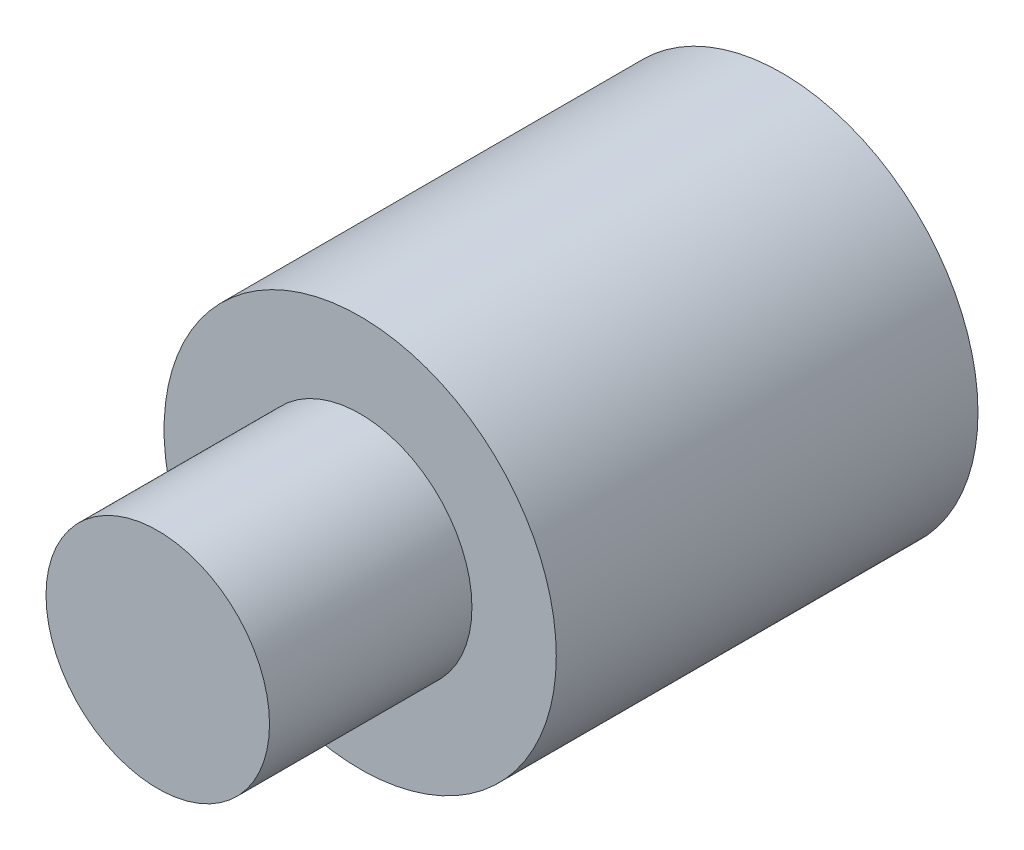
ISO-10303-21;
HEADER;
FILE_DESCRIPTION(('STEP AP214'),'2;1');
FILE_NAME('part.step','',(''),(''),'','','');
FILE_SCHEMA(('AUTOMOTIVE_DESIGN { 1 0 10303 214 1 1 1 1 }'));
ENDSEC;
DATA;
#1=APPLICATION_CONTEXT('core data for automotive mechanical design processes');
#2=APPLICATION_PROTOCOL_DEFINITION('international standard','automotive_design',2000,#1);
#3=PRODUCT_CONTEXT('',#1,'mechanical');
#4=PRODUCT('Part','Part','',(#3));
#5=PRODUCT_RELATED_PRODUCT_CATEGORY('part','',(#4));
#6=PRODUCT_DEFINITION_FORMATION('','',#4);
#7=PRODUCT_DEFINITION_CONTEXT('part definition',#1,'design');
#8=PRODUCT_DEFINITION('design','',#6,#7);
#9=PRODUCT_DEFINITION_SHAPE('','',#8);
#10=(LENGTH_UNIT() NAMED_UNIT(*) SI_UNIT(.MILLI.,.METRE.));
#11=(NAMED_UNIT(*) PLANE_ANGLE_UNIT() SI_UNIT($,.RADIAN.));
#12=(NAMED_UNIT(*) SI_UNIT($,.STERADIAN.) SOLID_ANGLE_UNIT());
#13=UNCERTAINTY_MEASURE_WITH_UNIT(LENGTH_MEASURE(1.E-05),#10,'distance_accuracy_value','');
#14=(GEOMETRIC_REPRESENTATION_CONTEXT(3) GLOBAL_UNCERTAINTY_ASSIGNED_CONTEXT((#13)) GLOBAL_UNIT_ASSIGNED_CONTEXT((#10,
#11,#12)) REPRESENTATION_CONTEXT('',''));
#15=CARTESIAN_POINT('',(0.,0.,0.));
#16=DIRECTION('',(0.,0.,1.));
#17=DIRECTION('',(1.,0.,0.));
#18=AXIS2_PLACEMENT_3D('',#15,#16,#17);
#19=CARTESIAN_POINT('',(0.,0.,0.));
#20=DIRECTION('',(0.,0.,1.));
#21=DIRECTION('',(1.,0.,0.));
#22=AXIS2_PLACEMENT_3D('',#19,#20,#21);
#23=PLANE('',#22);
#24=CARTESIAN_POINT('',(0.,0.,0.));
#25=DIRECTION('',(0.,0.,1.));
#26=DIRECTION('',(1.,0.,0.));
#27=AXIS2_PLACEMENT_3D('',#24,#25,#26);
#28=CIRCLE('',#27,4.65);
#29=CARTESIAN_POINT('',(4.65,0.,0.));
#30=VERTEX_POINT('',#29);
#31=EDGE_CURVE('E39',#30,#30,#28,.T.);
#32=ORIENTED_EDGE('',*,*,#31,.F.);
#33=EDGE_LOOP('',(#32));
#34=FACE_BOUND('',#33,.T.);
#35=CARTESIAN_POINT('',(0.,0.,0.));
#36=DIRECTION('',(0.,0.,1.));
#37=DIRECTION('',(1.,0.,0.));
#38=AXIS2_PLACEMENT_3D('',#35,#36,#37);
#39=CIRCLE('',#38,2.65);
#40=CARTESIAN_POINT('',(2.65,0.,0.));
#41=VERTEX_POINT('',#40);
#42=EDGE_CURVE('E47',#41,#41,#39,.T.);
#43=ORIENTED_EDGE('',*,*,#42,.T.);
#44=EDGE_LOOP('',(#43));
#45=FACE_BOUND('',#44,.T.);
#46=ADVANCED_FACE('F35',(#34,#45),#23,.F.);
#47=CARTESIAN_POINT('',(0.,0.,9.));
#48=DIRECTION('',(0.,0.,-1.));
#49=DIRECTION('',(-1.,0.,0.));
#50=AXIS2_PLACEMENT_3D('',#47,#48,#49);
#51=CYLINDRICAL_SURFACE('',#50,4.65);
#52=ORIENTED_EDGE('',*,*,#31,.T.);
#53=EDGE_LOOP('',(#52));
#54=FACE_BOUND('',#53,.T.);
#55=CARTESIAN_POINT('',(0.,0.,10.));
#56=DIRECTION('',(0.,0.,1.));
#57=DIRECTION('',(1.,0.,0.));
#58=AXIS2_PLACEMENT_3D('',#55,#56,#57);
#59=CIRCLE('',#58,4.65);
#60=CARTESIAN_POINT('',(4.65,0.,10.));
#61=VERTEX_POINT('',#60);
#62=EDGE_CURVE('E51',#61,#61,#59,.T.);
#63=ORIENTED_EDGE('',*,*,#62,.F.);
#64=EDGE_LOOP('',(#63));
#65=FACE_BOUND('',#64,.T.);
#66=ADVANCED_FACE('F37',(#54,#65),#51,.T.);
#67=CARTESIAN_POINT('',(0.,0.,9.));
#68=DIRECTION('',(0.,0.,-1.));
#69=DIRECTION('',(-1.,0.,0.));
#70=AXIS2_PLACEMENT_3D('',#67,#68,#69);
#71=CYLINDRICAL_SURFACE('',#70,2.65);
#72=CARTESIAN_POINT('',(0.,0.,9.));
#73=DIRECTION('',(0.,0.,1.));
#74=DIRECTION('',(1.,0.,0.));
#75=AXIS2_PLACEMENT_3D('',#72,#73,#74);
#76=CIRCLE('',#75,2.65);
#77=CARTESIAN_POINT('',(2.65,0.,9.));
#78=VERTEX_POINT('',#77);
#79=EDGE_CURVE('E54',#78,#78,#76,.T.);
#80=ORIENTED_EDGE('',*,*,#79,.T.);
#81=EDGE_LOOP('',(#80));
#82=FACE_BOUND('',#81,.T.);
#83=ORIENTED_EDGE('',*,*,#42,.F.);
#84=EDGE_LOOP('',(#83));
#85=FACE_BOUND('',#84,.T.);
#86=ADVANCED_FACE('F60',(#82,#85),#71,.F.);
#87=CARTESIAN_POINT('',(0.,0.,9.));
#88=DIRECTION('',(0.,0.,1.));
#89=DIRECTION('',(1.,0.,0.));
#90=AXIS2_PLACEMENT_3D('',#87,#88,#89);
#91=PLANE('',#90);
#92=ORIENTED_EDGE('',*,*,#79,.F.);
#93=EDGE_LOOP('',(#92));
#94=FACE_BOUND('',#93,.T.);
#95=ADVANCED_FACE('F62',(#94),#91,.F.);
#96=CARTESIAN_POINT('',(0.,0.,10.));
#97=DIRECTION('',(0.,0.,1.));
#98=DIRECTION('',(1.,0.,0.));
#99=AXIS2_PLACEMENT_3D('',#96,#97,#98);
#100=PLANE('',#99);
#101=CARTESIAN_POINT('',(0.,0.,10.));
#102=DIRECTION('',(0.,0.,1.));
#103=DIRECTION('',(1.,0.,0.));
#104=AXIS2_PLACEMENT_3D('',#101,#102,#103);
#105=CIRCLE('',#104,2.65);
#106=CARTESIAN_POINT('',(2.65,0.,10.));
#107=VERTEX_POINT('',#106);
#108=EDGE_CURVE('E10',#107,#107,#105,.T.);
#109=ORIENTED_EDGE('',*,*,#108,.F.);
#110=EDGE_LOOP('',(#109));
#111=FACE_BOUND('',#110,.T.);
#112=ORIENTED_EDGE('',*,*,#62,.T.);
#113=EDGE_LOOP('',(#112));
#114=FACE_BOUND('',#113,.T.);
#115=ADVANCED_FACE('F70',(#111,#114),#100,.T.);
#116=CARTESIAN_POINT('',(0.,0.,14.8));
#117=DIRECTION('',(0.,0.,-1.));
#118=DIRECTION('',(-1.,0.,0.));
#119=AXIS2_PLACEMENT_3D('',#116,#117,#118);
#120=CYLINDRICAL_SURFACE('',#119,2.65);
#121=CARTESIAN_POINT('',(0.,0.,14.8));
#122=DIRECTION('',(0.,0.,1.));
#123=DIRECTION('',(1.,0.,0.));
#124=AXIS2_PLACEMENT_3D('',#121,#122,#123);
#125=CIRCLE('',#124,2.65);
#126=CARTESIAN_POINT('',(2.65,0.,14.8));
#127=VERTEX_POINT('',#126);
#128=EDGE_CURVE('E50',#127,#127,#125,.T.);
#129=ORIENTED_EDGE('',*,*,#128,.F.);
#130=EDGE_LOOP('',(#129));
#131=FACE_BOUND('',#130,.T.);
#132=ORIENTED_EDGE('',*,*,#108,.T.);
#133=EDGE_LOOP('',(#132));
#134=FACE_BOUND('',#133,.T.);
#135=ADVANCED_FACE('F82',(#131,#134),#120,.T.);
#136=CARTESIAN_POINT('',(0.,0.,14.8));
#137=DIRECTION('',(0.,0.,1.));
#138=DIRECTION('',(1.,0.,0.));
#139=AXIS2_PLACEMENT_3D('',#136,#137,#138);
#140=PLANE('',#139);
#141=ORIENTED_EDGE('',*,*,#128,.T.);
#142=EDGE_LOOP('',(#141));
#143=FACE_BOUND('',#142,.T.);
#144=ADVANCED_FACE('F90',(#143),#140,.T.);
#145=CLOSED_SHELL('',(#46,#66,#86,#95,#115,#135,#144));
#146=MANIFOLD_SOLID_BREP('B2',#145);
#147=ADVANCED_BREP_SHAPE_REPRESENTATION('',(#18,#146),#14);
#148=SHAPE_DEFINITION_REPRESENTATION(#9,#147);
ENDSEC;
END-ISO-10303-21;
